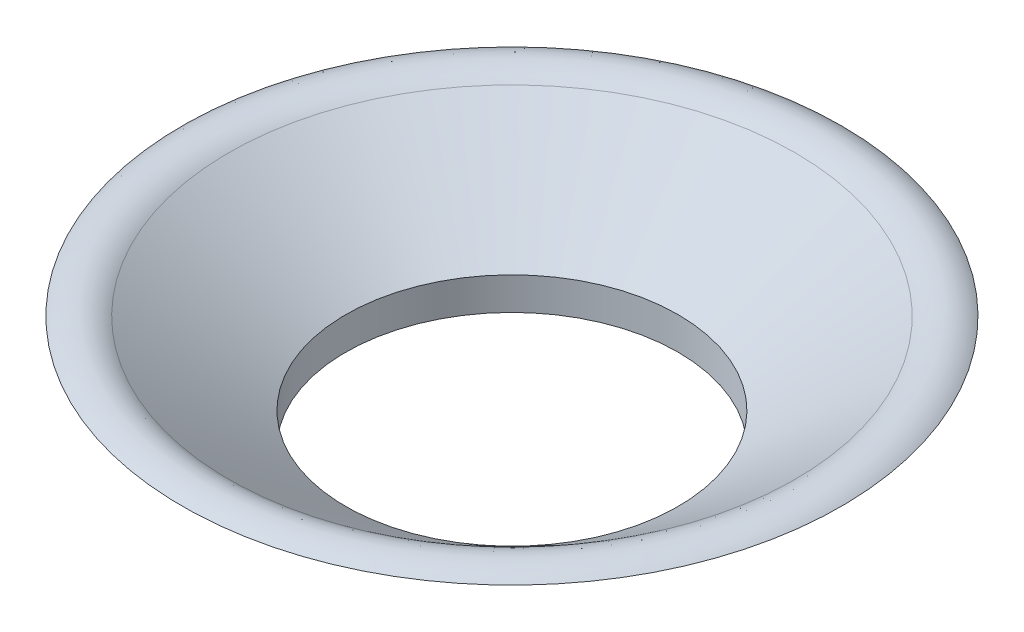
ISO-10303-21;
HEADER;
FILE_DESCRIPTION(('STEP AP214'),'2;1');
FILE_NAME('part.step','',(''),(''),'','','');
FILE_SCHEMA(('AUTOMOTIVE_DESIGN { 1 0 10303 214 1 1 1 1 }'));
ENDSEC;
DATA;
#1=APPLICATION_CONTEXT('core data for automotive mechanical design processes');
#2=APPLICATION_PROTOCOL_DEFINITION('international standard','automotive_design',2000,#1);
#3=PRODUCT_CONTEXT('',#1,'mechanical');
#4=PRODUCT('Part','Part','',(#3));
#5=PRODUCT_RELATED_PRODUCT_CATEGORY('part','',(#4));
#6=PRODUCT_DEFINITION_FORMATION('','',#4);
#7=PRODUCT_DEFINITION_CONTEXT('part definition',#1,'design');
#8=PRODUCT_DEFINITION('design','',#6,#7);
#9=PRODUCT_DEFINITION_SHAPE('','',#8);
#10=(LENGTH_UNIT() NAMED_UNIT(*) SI_UNIT(.MILLI.,.METRE.));
#11=(NAMED_UNIT(*) PLANE_ANGLE_UNIT() SI_UNIT($,.RADIAN.));
#12=(NAMED_UNIT(*) SI_UNIT($,.STERADIAN.) SOLID_ANGLE_UNIT());
#13=UNCERTAINTY_MEASURE_WITH_UNIT(LENGTH_MEASURE(1.E-05),#10,'distance_accuracy_value','');
#14=(GEOMETRIC_REPRESENTATION_CONTEXT(3) GLOBAL_UNCERTAINTY_ASSIGNED_CONTEXT((#13)) GLOBAL_UNIT_ASSIGNED_CONTEXT((#10,
#11,#12)) REPRESENTATION_CONTEXT('',''));
#15=CARTESIAN_POINT('',(0.,0.,0.));
#16=DIRECTION('',(0.,0.,1.));
#17=DIRECTION('',(1.,0.,0.));
#18=AXIS2_PLACEMENT_3D('',#15,#16,#17);
#19=CARTESIAN_POINT('',(0.,0.,0.));
#20=DIRECTION('',(0.,-1.,0.));
#21=DIRECTION('',(0.,0.,-1.));
#22=AXIS2_PLACEMENT_3D('',#19,#20,#21);
#23=CYLINDRICAL_SURFACE('',#22,50.);
#24=CARTESIAN_POINT('',(0.,0.,0.));
#25=DIRECTION('',(0.,-1.,0.));
#26=DIRECTION('',(0.,0.,-1.));
#27=AXIS2_PLACEMENT_3D('',#24,#25,#26);
#28=CIRCLE('',#27,50.);
#29=CARTESIAN_POINT('',(0.,0.,-50.));
#30=VERTEX_POINT('',#29);
#31=EDGE_CURVE('E49',#30,#30,#28,.T.);
#32=ORIENTED_EDGE('',*,*,#31,.T.);
#33=EDGE_LOOP('',(#32));
#34=FACE_BOUND('',#33,.T.);
#35=CARTESIAN_POINT('',(0.,9.79988276603414,0.));
#36=DIRECTION('',(0.,-1.,0.));
#37=DIRECTION('',(0.,0.,-1.));
#38=AXIS2_PLACEMENT_3D('',#35,#36,#37);
#39=CIRCLE('',#38,50.);
#40=CARTESIAN_POINT('',(0.,9.79988276603414,-50.));
#41=VERTEX_POINT('',#40);
#42=EDGE_CURVE('E10',#41,#41,#39,.T.);
#43=ORIENTED_EDGE('',*,*,#42,.F.);
#44=EDGE_LOOP('',(#43));
#45=FACE_BOUND('',#44,.T.);
#46=ADVANCED_FACE('F35',(#34,#45),#23,.F.);
#47=CARTESIAN_POINT('',(0.,34.4145861810628,0.));
#48=DIRECTION('',(0.,1.,0.));
#49=DIRECTION('',(0.,0.,1.));
#50=AXIS2_PLACEMENT_3D('',#47,#48,#49);
#51=CONICAL_SURFACE('',#50,85.1534396187215,0.95993108859688);
#52=ORIENTED_EDGE('',*,*,#42,.T.);
#53=EDGE_LOOP('',(#52));
#54=FACE_BOUND('',#53,.T.);
#55=CARTESIAN_POINT('',(0.,34.4145861810628,0.));
#56=DIRECTION('',(0.,-1.,0.));
#57=DIRECTION('',(0.,0.,-1.));
#58=AXIS2_PLACEMENT_3D('',#55,#56,#57);
#59=CIRCLE('',#58,85.1534396187215);
#60=CARTESIAN_POINT('',(0.,34.4145861810628,-85.1534396187215));
#61=VERTEX_POINT('',#60);
#62=EDGE_CURVE('E41',#61,#61,#59,.T.);
#63=ORIENTED_EDGE('',*,*,#62,.F.);
#64=EDGE_LOOP('',(#63));
#65=FACE_BOUND('',#64,.T.);
#66=ADVANCED_FACE('F65',(#54,#65),#51,.F.);
#67=CARTESIAN_POINT('',(0.,24.4206327637645,0.));
#68=DIRECTION('',(0.,-1.,0.));
#69=DIRECTION('',(0.,0.,-1.));
#70=AXIS2_PLACEMENT_3D('',#67,#68,#69);
#71=TOROIDAL_SURFACE('',#70,92.1512811380305,12.2003643731035);
#72=ORIENTED_EDGE('',*,*,#62,.T.);
#73=EDGE_LOOP('',(#72));
#74=FACE_BOUND('',#73,.T.);
#75=CARTESIAN_POINT('',(0.,34.4145861810628,0.));
#76=DIRECTION('',(0.,-1.,0.));
#77=DIRECTION('',(0.,0.,-1.));
#78=AXIS2_PLACEMENT_3D('',#75,#76,#77);
#79=CIRCLE('',#78,99.1491226573395);
#80=CARTESIAN_POINT('',(0.,34.4145861810628,-99.1491226573395));
#81=VERTEX_POINT('',#80);
#82=EDGE_CURVE('E45',#81,#81,#79,.T.);
#83=ORIENTED_EDGE('',*,*,#82,.F.);
#84=EDGE_LOOP('',(#83));
#85=FACE_BOUND('',#84,.T.);
#86=ADVANCED_FACE('F59',(#74,#85),#71,.T.);
#87=CARTESIAN_POINT('',(0.,0.,0.));
#88=DIRECTION('',(0.,1.,0.));
#89=DIRECTION('',(0.,0.,1.));
#90=AXIS2_PLACEMENT_3D('',#87,#88,#89);
#91=CONICAL_SURFACE('',#90,50.,0.95993108859688);
#92=ORIENTED_EDGE('',*,*,#82,.T.);
#93=EDGE_LOOP('',(#92));
#94=FACE_BOUND('',#93,.T.);
#95=ORIENTED_EDGE('',*,*,#31,.F.);
#96=EDGE_LOOP('',(#95));
#97=FACE_BOUND('',#96,.T.);
#98=ADVANCED_FACE('F57',(#94,#97),#91,.T.);
#99=CLOSED_SHELL('',(#46,#66,#86,#98));
#100=MANIFOLD_SOLID_BREP('B2',#99);
#101=ADVANCED_BREP_SHAPE_REPRESENTATION('',(#18,#100),#14);
#102=SHAPE_DEFINITION_REPRESENTATION(#9,#101);
ENDSEC;
END-ISO-10303-21;
